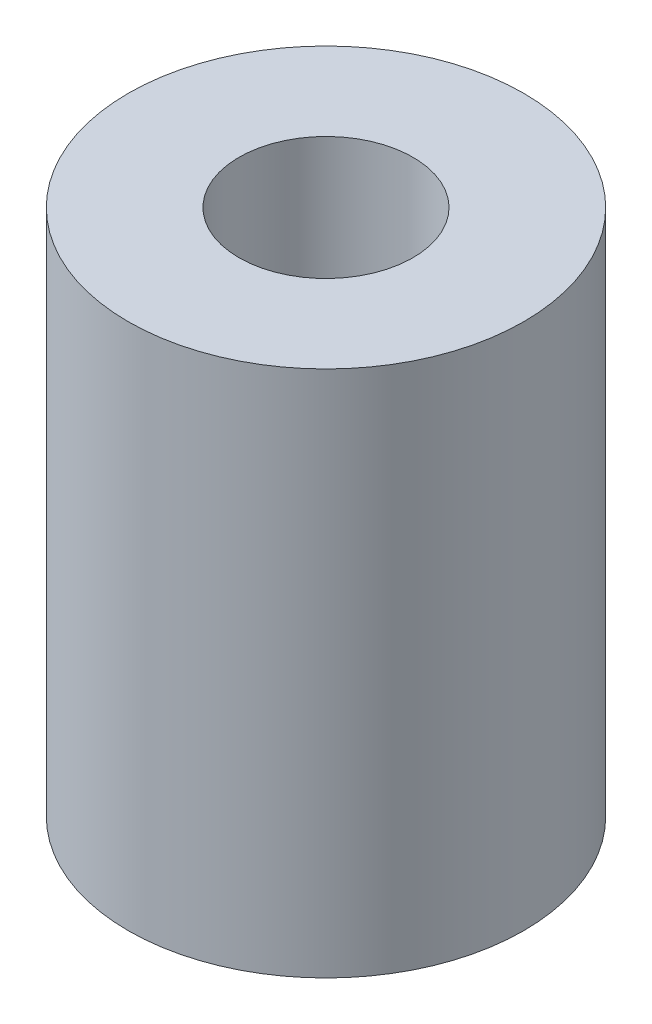
ISO-10303-21;
HEADER;
FILE_DESCRIPTION(('STEP AP214'),'2;1');
FILE_NAME('part.step','',(''),(''),'','','');
FILE_SCHEMA(('AUTOMOTIVE_DESIGN { 1 0 10303 214 1 1 1 1 }'));
ENDSEC;
DATA;
#1=APPLICATION_CONTEXT('core data for automotive mechanical design processes');
#2=APPLICATION_PROTOCOL_DEFINITION('international standard','automotive_design',2000,#1);
#3=PRODUCT_CONTEXT('',#1,'mechanical');
#4=PRODUCT('Part','Part','',(#3));
#5=PRODUCT_RELATED_PRODUCT_CATEGORY('part','',(#4));
#6=PRODUCT_DEFINITION_FORMATION('','',#4);
#7=PRODUCT_DEFINITION_CONTEXT('part definition',#1,'design');
#8=PRODUCT_DEFINITION('design','',#6,#7);
#9=PRODUCT_DEFINITION_SHAPE('','',#8);
#10=(LENGTH_UNIT() NAMED_UNIT(*) SI_UNIT(.MILLI.,.METRE.));
#11=(NAMED_UNIT(*) PLANE_ANGLE_UNIT() SI_UNIT($,.RADIAN.));
#12=(NAMED_UNIT(*) SI_UNIT($,.STERADIAN.) SOLID_ANGLE_UNIT());
#13=UNCERTAINTY_MEASURE_WITH_UNIT(LENGTH_MEASURE(1.E-05),#10,'distance_accuracy_value','');
#14=(GEOMETRIC_REPRESENTATION_CONTEXT(3) GLOBAL_UNCERTAINTY_ASSIGNED_CONTEXT((#13)) GLOBAL_UNIT_ASSIGNED_CONTEXT((#10,
#11,#12)) REPRESENTATION_CONTEXT('',''));
#15=CARTESIAN_POINT('',(0.,0.,0.));
#16=DIRECTION('',(0.,0.,1.));
#17=DIRECTION('',(1.,0.,0.));
#18=AXIS2_PLACEMENT_3D('',#15,#16,#17);
#19=CARTESIAN_POINT('',(0.,12.7,0.));
#20=DIRECTION('',(0.,1.,0.));
#21=DIRECTION('',(0.,0.,1.));
#22=AXIS2_PLACEMENT_3D('',#19,#20,#21);
#23=PLANE('',#22);
#24=CARTESIAN_POINT('',(0.,12.7,0.));
#25=DIRECTION('',(0.,1.,0.));
#26=DIRECTION('',(0.,0.,1.));
#27=AXIS2_PLACEMENT_3D('',#24,#25,#26);
#28=CIRCLE('',#27,4.7625);
#29=CARTESIAN_POINT('',(0.,12.7,4.7625));
#30=VERTEX_POINT('',#29);
#31=EDGE_CURVE('E10',#30,#30,#28,.T.);
#32=ORIENTED_EDGE('',*,*,#31,.T.);
#33=EDGE_LOOP('',(#32));
#34=FACE_BOUND('',#33,.T.);
#35=CARTESIAN_POINT('',(0.,12.7,0.));
#36=DIRECTION('',(0.,1.,0.));
#37=DIRECTION('',(0.,0.,1.));
#38=AXIS2_PLACEMENT_3D('',#35,#36,#37);
#39=CIRCLE('',#38,2.0955);
#40=CARTESIAN_POINT('',(0.,12.7,2.0955));
#41=VERTEX_POINT('',#40);
#42=EDGE_CURVE('E56',#41,#41,#39,.T.);
#43=ORIENTED_EDGE('',*,*,#42,.F.);
#44=EDGE_LOOP('',(#43));
#45=FACE_BOUND('',#44,.T.);
#46=ADVANCED_FACE('F43',(#34,#45),#23,.T.);
#47=CARTESIAN_POINT('',(0.,0.,0.));
#48=DIRECTION('',(0.,1.,0.));
#49=DIRECTION('',(0.,0.,1.));
#50=AXIS2_PLACEMENT_3D('',#47,#48,#49);
#51=PLANE('',#50);
#52=CARTESIAN_POINT('',(0.,0.,0.));
#53=DIRECTION('',(0.,1.,0.));
#54=DIRECTION('',(0.,0.,1.));
#55=AXIS2_PLACEMENT_3D('',#52,#53,#54);
#56=CIRCLE('',#55,4.7625);
#57=CARTESIAN_POINT('',(0.,0.,4.7625));
#58=VERTEX_POINT('',#57);
#59=EDGE_CURVE('E47',#58,#58,#56,.T.);
#60=ORIENTED_EDGE('',*,*,#59,.F.);
#61=EDGE_LOOP('',(#60));
#62=FACE_BOUND('',#61,.T.);
#63=CARTESIAN_POINT('',(0.,0.,0.));
#64=DIRECTION('',(0.,1.,0.));
#65=DIRECTION('',(0.,0.,1.));
#66=AXIS2_PLACEMENT_3D('',#63,#64,#65);
#67=CIRCLE('',#66,2.0955);
#68=CARTESIAN_POINT('',(0.,0.,2.0955));
#69=VERTEX_POINT('',#68);
#70=EDGE_CURVE('E58',#69,#69,#67,.T.);
#71=ORIENTED_EDGE('',*,*,#70,.T.);
#72=EDGE_LOOP('',(#71));
#73=FACE_BOUND('',#72,.T.);
#74=ADVANCED_FACE('F70',(#62,#73),#51,.F.);
#75=CARTESIAN_POINT('',(0.,12.7,0.));
#76=DIRECTION('',(0.,-1.,0.));
#77=DIRECTION('',(0.,0.,-1.));
#78=AXIS2_PLACEMENT_3D('',#75,#76,#77);
#79=CYLINDRICAL_SURFACE('',#78,4.7625);
#80=ORIENTED_EDGE('',*,*,#31,.F.);
#81=EDGE_LOOP('',(#80));
#82=FACE_BOUND('',#81,.T.);
#83=ORIENTED_EDGE('',*,*,#59,.T.);
#84=EDGE_LOOP('',(#83));
#85=FACE_BOUND('',#84,.T.);
#86=ADVANCED_FACE('F45',(#82,#85),#79,.T.);
#87=CARTESIAN_POINT('',(0.,12.7,0.));
#88=DIRECTION('',(0.,-1.,0.));
#89=DIRECTION('',(0.,0.,-1.));
#90=AXIS2_PLACEMENT_3D('',#87,#88,#89);
#91=CYLINDRICAL_SURFACE('',#90,2.0955);
#92=ORIENTED_EDGE('',*,*,#42,.T.);
#93=EDGE_LOOP('',(#92));
#94=FACE_BOUND('',#93,.T.);
#95=ORIENTED_EDGE('',*,*,#70,.F.);
#96=EDGE_LOOP('',(#95));
#97=FACE_BOUND('',#96,.T.);
#98=ADVANCED_FACE('F66',(#94,#97),#91,.F.);
#99=CLOSED_SHELL('',(#46,#74,#86,#98));
#100=MANIFOLD_SOLID_BREP('B2',#99);
#101=ADVANCED_BREP_SHAPE_REPRESENTATION('',(#18,#100),#14);
#102=SHAPE_DEFINITION_REPRESENTATION(#9,#101);
ENDSEC;
END-ISO-10303-21;
